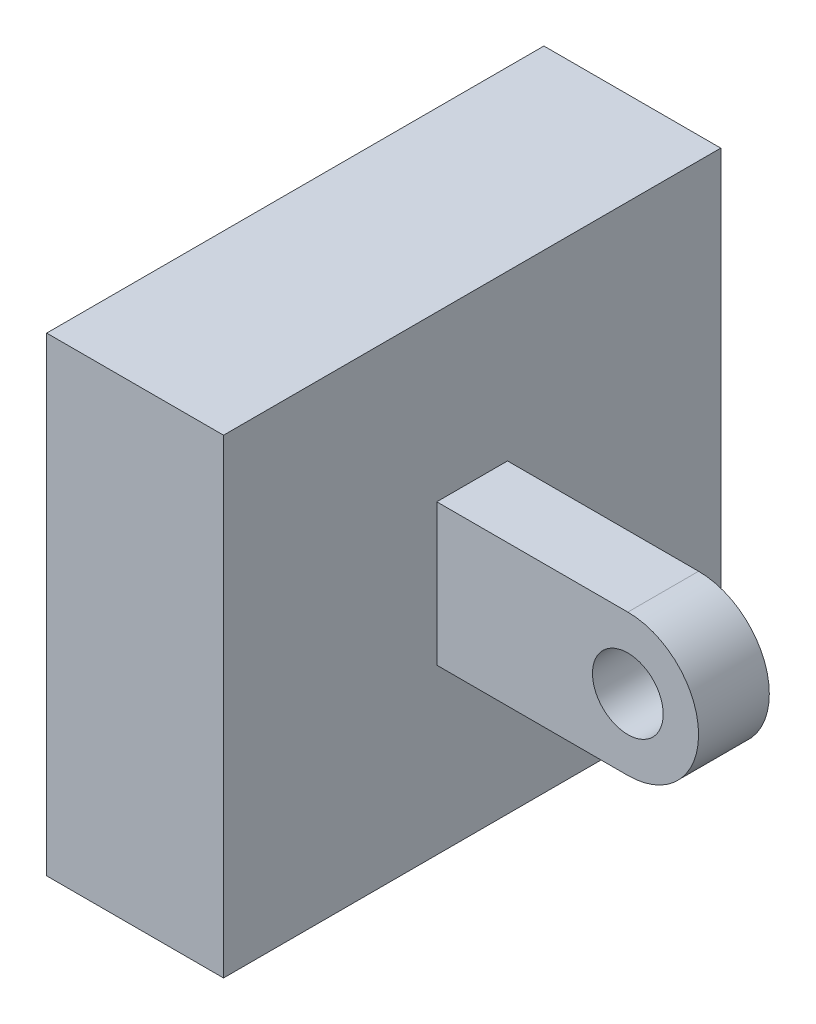
ISO-10303-21;
HEADER;
FILE_DESCRIPTION(('STEP AP214'),'2;1');
FILE_NAME('part.step','',(''),(''),'','','');
FILE_SCHEMA(('AUTOMOTIVE_DESIGN { 1 0 10303 214 1 1 1 1 }'));
ENDSEC;
DATA;
#1=APPLICATION_CONTEXT('core data for automotive mechanical design processes');
#2=APPLICATION_PROTOCOL_DEFINITION('international standard','automotive_design',2000,#1);
#3=PRODUCT_CONTEXT('',#1,'mechanical');
#4=PRODUCT('Part','Part','',(#3));
#5=PRODUCT_RELATED_PRODUCT_CATEGORY('part','',(#4));
#6=PRODUCT_DEFINITION_FORMATION('','',#4);
#7=PRODUCT_DEFINITION_CONTEXT('part definition',#1,'design');
#8=PRODUCT_DEFINITION('design','',#6,#7);
#9=PRODUCT_DEFINITION_SHAPE('','',#8);
#10=(LENGTH_UNIT() NAMED_UNIT(*) SI_UNIT(.MILLI.,.METRE.));
#11=(NAMED_UNIT(*) PLANE_ANGLE_UNIT() SI_UNIT($,.RADIAN.));
#12=(NAMED_UNIT(*) SI_UNIT($,.STERADIAN.) SOLID_ANGLE_UNIT());
#13=UNCERTAINTY_MEASURE_WITH_UNIT(LENGTH_MEASURE(1.E-05),#10,'distance_accuracy_value','');
#14=(GEOMETRIC_REPRESENTATION_CONTEXT(3) GLOBAL_UNCERTAINTY_ASSIGNED_CONTEXT((#13)) GLOBAL_UNIT_ASSIGNED_CONTEXT((#10,
#11,#12)) REPRESENTATION_CONTEXT('',''));
#15=CARTESIAN_POINT('',(0.,0.,0.));
#16=DIRECTION('',(0.,0.,1.));
#17=DIRECTION('',(1.,0.,0.));
#18=AXIS2_PLACEMENT_3D('',#15,#16,#17);
#19=CARTESIAN_POINT('',(0.,0.,-20.));
#20=DIRECTION('',(0.,0.,1.));
#21=DIRECTION('',(1.,0.,0.));
#22=AXIS2_PLACEMENT_3D('',#19,#20,#21);
#23=CYLINDRICAL_SURFACE('',#22,40.);
#24=DIRECTION('',(0.,0.,1.));
#25=VECTOR('',#24,1.);
#26=CARTESIAN_POINT('',(0.,40.,-20.));
#27=LINE('',#26,#25);
#28=CARTESIAN_POINT('',(0.,40.,-20.));
#29=VERTEX_POINT('',#28);
#30=CARTESIAN_POINT('',(0.,40.,20.));
#31=VERTEX_POINT('',#30);
#32=EDGE_CURVE('E42',#29,#31,#27,.T.);
#33=ORIENTED_EDGE('',*,*,#32,.T.);
#34=CARTESIAN_POINT('',(0.,0.,20.));
#35=DIRECTION('',(0.,0.,1.));
#36=DIRECTION('',(-1.,0.,0.));
#37=AXIS2_PLACEMENT_3D('',#34,#35,#36);
#38=CIRCLE('',#37,40.);
#39=CARTESIAN_POINT('',(0.,-40.,20.));
#40=VERTEX_POINT('',#39);
#41=EDGE_CURVE('E133',#40,#31,#38,.T.);
#42=ORIENTED_EDGE('',*,*,#41,.F.);
#43=DIRECTION('',(0.,0.,1.));
#44=VECTOR('',#43,1.);
#45=CARTESIAN_POINT('',(0.,-40.,-20.));
#46=LINE('',#45,#44);
#47=CARTESIAN_POINT('',(0.,-40.,-20.));
#48=VERTEX_POINT('',#47);
#49=EDGE_CURVE('E11',#48,#40,#46,.T.);
#50=ORIENTED_EDGE('',*,*,#49,.F.);
#51=CARTESIAN_POINT('',(0.,0.,-20.));
#52=DIRECTION('',(0.,0.,1.));
#53=DIRECTION('',(-1.,0.,0.));
#54=AXIS2_PLACEMENT_3D('',#51,#52,#53);
#55=CIRCLE('',#54,40.);
#56=EDGE_CURVE('E152',#48,#29,#55,.T.);
#57=ORIENTED_EDGE('',*,*,#56,.T.);
#58=EDGE_LOOP('',(#33,#42,#50,#57));
#59=FACE_BOUND('',#58,.T.);
#60=ADVANCED_FACE('F39',(#59),#23,.T.);
#61=CARTESIAN_POINT('',(0.,-40.,-20.));
#62=DIRECTION('',(0.,-1.,0.));
#63=DIRECTION('',(0.,0.,-1.));
#64=AXIS2_PLACEMENT_3D('',#61,#62,#63);
#65=PLANE('',#64);
#66=ORIENTED_EDGE('',*,*,#49,.T.);
#67=DIRECTION('',(1.,0.,0.));
#68=VECTOR('',#67,1.);
#69=CARTESIAN_POINT('',(0.,-40.,20.));
#70=LINE('',#69,#68);
#71=CARTESIAN_POINT('',(-108.026251169486,-40.,20.));
#72=VERTEX_POINT('',#71);
#73=EDGE_CURVE('E146',#72,#40,#70,.T.);
#74=ORIENTED_EDGE('',*,*,#73,.F.);
#75=DIRECTION('',(0.,0.,1.));
#76=VECTOR('',#75,1.);
#77=CARTESIAN_POINT('',(-108.026251169486,-40.,-20.));
#78=LINE('',#77,#76);
#79=CARTESIAN_POINT('',(-108.026251169486,-40.,-20.));
#80=VERTEX_POINT('',#79);
#81=EDGE_CURVE('E47',#80,#72,#78,.T.);
#82=ORIENTED_EDGE('',*,*,#81,.F.);
#83=DIRECTION('',(1.,0.,0.));
#84=VECTOR('',#83,1.);
#85=CARTESIAN_POINT('',(0.,-40.,-20.));
#86=LINE('',#85,#84);
#87=EDGE_CURVE('E157',#80,#48,#86,.T.);
#88=ORIENTED_EDGE('',*,*,#87,.T.);
#89=EDGE_LOOP('',(#66,#74,#82,#88));
#90=FACE_BOUND('',#89,.T.);
#91=ADVANCED_FACE('F173',(#90),#65,.T.);
#92=CARTESIAN_POINT('',(0.,40.,-20.));
#93=DIRECTION('',(0.,1.,0.));
#94=DIRECTION('',(0.,0.,1.));
#95=AXIS2_PLACEMENT_3D('',#92,#93,#94);
#96=PLANE('',#95);
#97=DIRECTION('',(0.,0.,1.));
#98=VECTOR('',#97,1.);
#99=CARTESIAN_POINT('',(-108.026251169486,40.,-20.));
#100=LINE('',#99,#98);
#101=CARTESIAN_POINT('',(-108.026251169486,40.,-20.));
#102=VERTEX_POINT('',#101);
#103=CARTESIAN_POINT('',(-108.026251169486,40.,20.));
#104=VERTEX_POINT('',#103);
#105=EDGE_CURVE('E161',#102,#104,#100,.T.);
#106=ORIENTED_EDGE('',*,*,#105,.T.);
#107=DIRECTION('',(-1.,0.,0.));
#108=VECTOR('',#107,1.);
#109=CARTESIAN_POINT('',(0.,40.,20.));
#110=LINE('',#109,#108);
#111=EDGE_CURVE('E141',#31,#104,#110,.T.);
#112=ORIENTED_EDGE('',*,*,#111,.F.);
#113=ORIENTED_EDGE('',*,*,#32,.F.);
#114=DIRECTION('',(-1.,0.,0.));
#115=VECTOR('',#114,1.);
#116=CARTESIAN_POINT('',(0.,40.,-20.));
#117=LINE('',#116,#115);
#118=EDGE_CURVE('E154',#29,#102,#117,.T.);
#119=ORIENTED_EDGE('',*,*,#118,.T.);
#120=EDGE_LOOP('',(#106,#112,#113,#119));
#121=FACE_BOUND('',#120,.T.);
#122=ADVANCED_FACE('F165',(#121),#96,.T.);
#123=CARTESIAN_POINT('',(0.,0.,-20.));
#124=DIRECTION('',(0.,0.,-1.));
#125=DIRECTION('',(-1.,0.,0.));
#126=AXIS2_PLACEMENT_3D('',#123,#124,#125);
#127=PLANE('',#126);
#128=CARTESIAN_POINT('',(0.,0.,-20.));
#129=DIRECTION('',(0.,0.,1.));
#130=DIRECTION('',(1.,0.,0.));
#131=AXIS2_PLACEMENT_3D('',#128,#129,#130);
#132=CIRCLE('',#131,20.);
#133=CARTESIAN_POINT('',(20.,0.,-20.));
#134=VERTEX_POINT('',#133);
#135=EDGE_CURVE('E149',#134,#134,#132,.T.);
#136=ORIENTED_EDGE('',*,*,#135,.T.);
#137=EDGE_LOOP('',(#136));
#138=FACE_BOUND('',#137,.T.);
#139=ORIENTED_EDGE('',*,*,#56,.F.);
#140=ORIENTED_EDGE('',*,*,#87,.F.);
#141=DIRECTION('',(0.,-1.,0.));
#142=VECTOR('',#141,1.);
#143=CARTESIAN_POINT('',(-108.026251169486,-40.,-20.));
#144=LINE('',#143,#142);
#145=EDGE_CURVE('E61',#102,#80,#144,.T.);
#146=ORIENTED_EDGE('',*,*,#145,.F.);
#147=ORIENTED_EDGE('',*,*,#118,.F.);
#148=EDGE_LOOP('',(#139,#140,#146,#147));
#149=FACE_BOUND('',#148,.T.);
#150=ADVANCED_FACE('F224',(#138,#149),#127,.T.);
#151=CARTESIAN_POINT('',(0.,0.,-20.));
#152=DIRECTION('',(0.,0.,1.));
#153=DIRECTION('',(1.,0.,0.));
#154=AXIS2_PLACEMENT_3D('',#151,#152,#153);
#155=CYLINDRICAL_SURFACE('',#154,20.);
#156=ORIENTED_EDGE('',*,*,#135,.F.);
#157=EDGE_LOOP('',(#156));
#158=FACE_BOUND('',#157,.T.);
#159=CARTESIAN_POINT('',(0.,0.,20.));
#160=DIRECTION('',(0.,0.,1.));
#161=DIRECTION('',(1.,0.,0.));
#162=AXIS2_PLACEMENT_3D('',#159,#160,#161);
#163=CIRCLE('',#162,20.);
#164=CARTESIAN_POINT('',(20.,0.,20.));
#165=VERTEX_POINT('',#164);
#166=EDGE_CURVE('E130',#165,#165,#163,.T.);
#167=ORIENTED_EDGE('',*,*,#166,.T.);
#168=EDGE_LOOP('',(#167));
#169=FACE_BOUND('',#168,.T.);
#170=ADVANCED_FACE('F228',(#158,#169),#155,.F.);
#171=CARTESIAN_POINT('',(0.,0.,20.));
#172=DIRECTION('',(0.,0.,-1.));
#173=DIRECTION('',(-1.,0.,0.));
#174=AXIS2_PLACEMENT_3D('',#171,#172,#173);
#175=PLANE('',#174);
#176=ORIENTED_EDGE('',*,*,#41,.T.);
#177=ORIENTED_EDGE('',*,*,#111,.T.);
#178=DIRECTION('',(0.,-1.,0.));
#179=VECTOR('',#178,1.);
#180=CARTESIAN_POINT('',(-108.026251169486,-40.,20.));
#181=LINE('',#180,#179);
#182=EDGE_CURVE('E144',#104,#72,#181,.T.);
#183=ORIENTED_EDGE('',*,*,#182,.T.);
#184=ORIENTED_EDGE('',*,*,#73,.T.);
#185=EDGE_LOOP('',(#176,#177,#183,#184));
#186=FACE_BOUND('',#185,.T.);
#187=ORIENTED_EDGE('',*,*,#166,.F.);
#188=EDGE_LOOP('',(#187));
#189=FACE_BOUND('',#188,.T.);
#190=ADVANCED_FACE('F168',(#186,#189),#175,.F.);
#191=CARTESIAN_POINT('',(-208.026251169486,-132.903770188638,140.575859951597));
#192=DIRECTION('',(0.,0.,-1.));
#193=DIRECTION('',(-1.,0.,0.));
#194=AXIS2_PLACEMENT_3D('',#191,#192,#193);
#195=PLANE('',#194);
#196=DIRECTION('',(0.,1.,0.));
#197=VECTOR('',#196,1.);
#198=CARTESIAN_POINT('',(-108.026251169486,-132.903770188638,140.575859951597));
#199=LINE('',#198,#197);
#200=CARTESIAN_POINT('',(-108.026251169486,-132.903770188638,140.575859951597));
#201=VERTEX_POINT('',#200);
#202=CARTESIAN_POINT('',(-108.026251169486,132.903770188638,140.575859951597));
#203=VERTEX_POINT('',#202);
#204=EDGE_CURVE('E129',#201,#203,#199,.T.);
#205=ORIENTED_EDGE('',*,*,#204,.T.);
#206=DIRECTION('',(1.,0.,0.));
#207=VECTOR('',#206,1.);
#208=CARTESIAN_POINT('',(-208.026251169486,132.903770188638,140.575859951597));
#209=LINE('',#208,#207);
#210=CARTESIAN_POINT('',(-208.026251169486,132.903770188638,140.575859951597));
#211=VERTEX_POINT('',#210);
#212=EDGE_CURVE('E109',#211,#203,#209,.T.);
#213=ORIENTED_EDGE('',*,*,#212,.F.);
#214=DIRECTION('',(0.,1.,0.));
#215=VECTOR('',#214,1.);
#216=CARTESIAN_POINT('',(-208.026251169486,-132.903770188638,140.575859951597));
#217=LINE('',#216,#215);
#218=CARTESIAN_POINT('',(-208.026251169486,-132.903770188638,140.575859951597));
#219=VERTEX_POINT('',#218);
#220=EDGE_CURVE('E116',#219,#211,#217,.T.);
#221=ORIENTED_EDGE('',*,*,#220,.F.);
#222=DIRECTION('',(1.,0.,0.));
#223=VECTOR('',#222,1.);
#224=CARTESIAN_POINT('',(-208.026251169486,-132.903770188638,140.575859951597));
#225=LINE('',#224,#223);
#226=EDGE_CURVE('E195',#219,#201,#225,.T.);
#227=ORIENTED_EDGE('',*,*,#226,.T.);
#228=EDGE_LOOP('',(#205,#213,#221,#227));
#229=FACE_BOUND('',#228,.T.);
#230=ADVANCED_FACE('F127',(#229),#195,.F.);
#231=CARTESIAN_POINT('',(-208.026251169486,132.903770188638,-140.575859951597));
#232=DIRECTION('',(0.,-1.,0.));
#233=DIRECTION('',(0.,0.,-1.));
#234=AXIS2_PLACEMENT_3D('',#231,#232,#233);
#235=PLANE('',#234);
#236=DIRECTION('',(0.,0.,-1.));
#237=VECTOR('',#236,1.);
#238=CARTESIAN_POINT('',(-108.026251169486,132.903770188638,-140.575859951597));
#239=LINE('',#238,#237);
#240=CARTESIAN_POINT('',(-108.026251169486,132.903770188638,-140.575859951597));
#241=VERTEX_POINT('',#240);
#242=EDGE_CURVE('E182',#203,#241,#239,.T.);
#243=ORIENTED_EDGE('',*,*,#242,.T.);
#244=DIRECTION('',(1.,0.,0.));
#245=VECTOR('',#244,1.);
#246=CARTESIAN_POINT('',(-208.026251169486,132.903770188638,-140.575859951597));
#247=LINE('',#246,#245);
#248=CARTESIAN_POINT('',(-208.026251169486,132.903770188638,-140.575859951597));
#249=VERTEX_POINT('',#248);
#250=EDGE_CURVE('E112',#249,#241,#247,.T.);
#251=ORIENTED_EDGE('',*,*,#250,.F.);
#252=DIRECTION('',(0.,0.,-1.));
#253=VECTOR('',#252,1.);
#254=CARTESIAN_POINT('',(-208.026251169486,132.903770188638,-140.575859951597));
#255=LINE('',#254,#253);
#256=EDGE_CURVE('E105',#211,#249,#255,.T.);
#257=ORIENTED_EDGE('',*,*,#256,.F.);
#258=ORIENTED_EDGE('',*,*,#212,.T.);
#259=EDGE_LOOP('',(#243,#251,#257,#258));
#260=FACE_BOUND('',#259,.T.);
#261=ADVANCED_FACE('F107',(#260),#235,.F.);
#262=CARTESIAN_POINT('',(-208.026251169486,-132.903770188638,-140.575859951597));
#263=DIRECTION('',(0.,0.,1.));
#264=DIRECTION('',(1.,0.,0.));
#265=AXIS2_PLACEMENT_3D('',#262,#263,#264);
#266=PLANE('',#265);
#267=DIRECTION('',(0.,-1.,0.));
#268=VECTOR('',#267,1.);
#269=CARTESIAN_POINT('',(-108.026251169486,-132.903770188638,-140.575859951597));
#270=LINE('',#269,#268);
#271=CARTESIAN_POINT('',(-108.026251169486,-132.903770188638,-140.575859951597));
#272=VERTEX_POINT('',#271);
#273=EDGE_CURVE('E185',#241,#272,#270,.T.);
#274=ORIENTED_EDGE('',*,*,#273,.T.);
#275=DIRECTION('',(1.,0.,0.));
#276=VECTOR('',#275,1.);
#277=CARTESIAN_POINT('',(-208.026251169486,-132.903770188638,-140.575859951597));
#278=LINE('',#277,#276);
#279=CARTESIAN_POINT('',(-208.026251169486,-132.903770188638,-140.575859951597));
#280=VERTEX_POINT('',#279);
#281=EDGE_CURVE('E135',#280,#272,#278,.T.);
#282=ORIENTED_EDGE('',*,*,#281,.F.);
#283=DIRECTION('',(0.,-1.,0.));
#284=VECTOR('',#283,1.);
#285=CARTESIAN_POINT('',(-208.026251169486,-132.903770188638,-140.575859951597));
#286=LINE('',#285,#284);
#287=EDGE_CURVE('E115',#249,#280,#286,.T.);
#288=ORIENTED_EDGE('',*,*,#287,.F.);
#289=ORIENTED_EDGE('',*,*,#250,.T.);
#290=EDGE_LOOP('',(#274,#282,#288,#289));
#291=FACE_BOUND('',#290,.T.);
#292=ADVANCED_FACE('F201',(#291),#266,.F.);
#293=CARTESIAN_POINT('',(-208.026251169486,-132.903770188638,-140.575859951597));
#294=DIRECTION('',(0.,1.,0.));
#295=DIRECTION('',(0.,0.,1.));
#296=AXIS2_PLACEMENT_3D('',#293,#294,#295);
#297=PLANE('',#296);
#298=DIRECTION('',(0.,0.,1.));
#299=VECTOR('',#298,1.);
#300=CARTESIAN_POINT('',(-108.026251169486,-132.903770188638,-140.575859951597));
#301=LINE('',#300,#299);
#302=EDGE_CURVE('E125',#272,#201,#301,.T.);
#303=ORIENTED_EDGE('',*,*,#302,.T.);
#304=ORIENTED_EDGE('',*,*,#226,.F.);
#305=DIRECTION('',(0.,0.,1.));
#306=VECTOR('',#305,1.);
#307=CARTESIAN_POINT('',(-208.026251169486,-132.903770188638,-140.575859951597));
#308=LINE('',#307,#306);
#309=EDGE_CURVE('E121',#280,#219,#308,.T.);
#310=ORIENTED_EDGE('',*,*,#309,.F.);
#311=ORIENTED_EDGE('',*,*,#281,.T.);
#312=EDGE_LOOP('',(#303,#304,#310,#311));
#313=FACE_BOUND('',#312,.T.);
#314=ADVANCED_FACE('F199',(#313),#297,.F.);
#315=CARTESIAN_POINT('',(-208.026251169486,0.,0.));
#316=DIRECTION('',(1.,0.,0.));
#317=DIRECTION('',(0.,0.,-1.));
#318=AXIS2_PLACEMENT_3D('',#315,#316,#317);
#319=PLANE('',#318);
#320=CARTESIAN_POINT('',(-208.026251169486,0.,0.));
#321=DIRECTION('',(-1.,0.,0.));
#322=DIRECTION('',(0.,0.,1.));
#323=AXIS2_PLACEMENT_3D('',#320,#321,#322);
#324=CIRCLE('',#323,20.);
#325=CARTESIAN_POINT('',(-208.026251169486,0.,20.));
#326=VERTEX_POINT('',#325);
#327=EDGE_CURVE('E188',#326,#326,#324,.T.);
#328=ORIENTED_EDGE('',*,*,#327,.F.);
#329=EDGE_LOOP('',(#328));
#330=FACE_BOUND('',#329,.T.);
#331=ORIENTED_EDGE('',*,*,#220,.T.);
#332=ORIENTED_EDGE('',*,*,#256,.T.);
#333=ORIENTED_EDGE('',*,*,#287,.T.);
#334=ORIENTED_EDGE('',*,*,#309,.T.);
#335=EDGE_LOOP('',(#331,#332,#333,#334));
#336=FACE_BOUND('',#335,.T.);
#337=ADVANCED_FACE('F119',(#330,#336),#319,.F.);
#338=CARTESIAN_POINT('',(-108.026251169486,0.,0.));
#339=DIRECTION('',(1.,0.,0.));
#340=DIRECTION('',(0.,0.,-1.));
#341=AXIS2_PLACEMENT_3D('',#338,#339,#340);
#342=PLANE('',#341);
#343=ORIENTED_EDGE('',*,*,#145,.T.);
#344=ORIENTED_EDGE('',*,*,#81,.T.);
#345=ORIENTED_EDGE('',*,*,#182,.F.);
#346=ORIENTED_EDGE('',*,*,#105,.F.);
#347=EDGE_LOOP('',(#343,#344,#345,#346));
#348=FACE_BOUND('',#347,.T.);
#349=ORIENTED_EDGE('',*,*,#204,.F.);
#350=ORIENTED_EDGE('',*,*,#302,.F.);
#351=ORIENTED_EDGE('',*,*,#273,.F.);
#352=ORIENTED_EDGE('',*,*,#242,.F.);
#353=EDGE_LOOP('',(#349,#350,#351,#352));
#354=FACE_BOUND('',#353,.T.);
#355=ADVANCED_FACE('F175',(#348,#354),#342,.T.);
#356=CARTESIAN_POINT('',(-188.026251169486,0.,0.));
#357=DIRECTION('',(-1.,0.,0.));
#358=DIRECTION('',(0.,0.,1.));
#359=AXIS2_PLACEMENT_3D('',#356,#357,#358);
#360=CYLINDRICAL_SURFACE('',#359,20.);
#361=CARTESIAN_POINT('',(-188.026251169486,0.,0.));
#362=DIRECTION('',(-1.,0.,0.));
#363=DIRECTION('',(0.,0.,1.));
#364=AXIS2_PLACEMENT_3D('',#361,#362,#363);
#365=CIRCLE('',#364,20.);
#366=CARTESIAN_POINT('',(-188.026251169486,0.,20.));
#367=VERTEX_POINT('',#366);
#368=EDGE_CURVE('E183',#367,#367,#365,.T.);
#369=ORIENTED_EDGE('',*,*,#368,.F.);
#370=EDGE_LOOP('',(#369));
#371=FACE_BOUND('',#370,.T.);
#372=ORIENTED_EDGE('',*,*,#327,.T.);
#373=EDGE_LOOP('',(#372));
#374=FACE_BOUND('',#373,.T.);
#375=ADVANCED_FACE('F178',(#371,#374),#360,.F.);
#376=CARTESIAN_POINT('',(-188.026251169486,0.,0.));
#377=DIRECTION('',(-1.,0.,0.));
#378=DIRECTION('',(0.,0.,1.));
#379=AXIS2_PLACEMENT_3D('',#376,#377,#378);
#380=PLANE('',#379);
#381=ORIENTED_EDGE('',*,*,#368,.T.);
#382=EDGE_LOOP('',(#381));
#383=FACE_BOUND('',#382,.T.);
#384=ADVANCED_FACE('F265',(#383),#380,.T.);
#385=CLOSED_SHELL('',(#60,#91,#122,#150,#170,#190,#230,#261,#292,#314,#337,#355,#375,#384));
#386=MANIFOLD_SOLID_BREP('B2',#385);
#387=ADVANCED_BREP_SHAPE_REPRESENTATION('',(#18,#386),#14);
#388=SHAPE_DEFINITION_REPRESENTATION(#9,#387);
ENDSEC;
END-ISO-10303-21;
